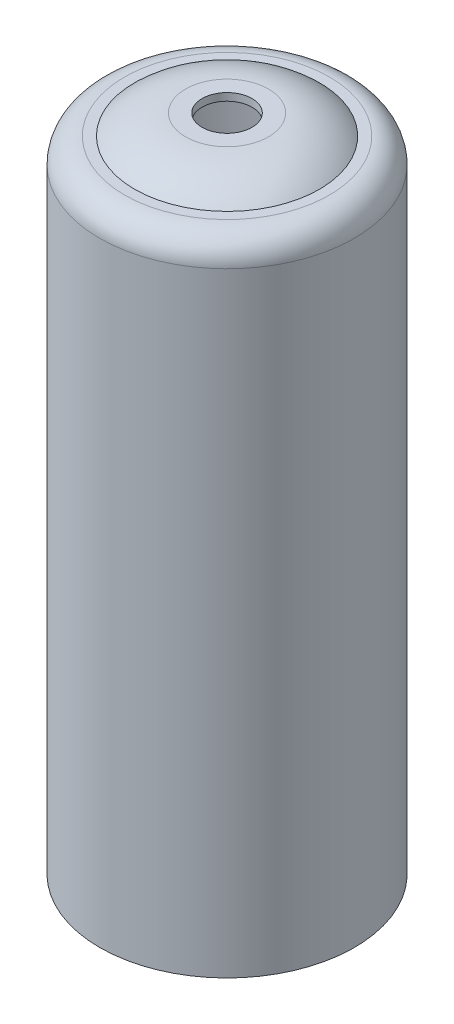
ISO-10303-21;
HEADER;
FILE_DESCRIPTION(('STEP AP214'),'2;1');
FILE_NAME('part.step','',(''),(''),'','','');
FILE_SCHEMA(('AUTOMOTIVE_DESIGN { 1 0 10303 214 1 1 1 1 }'));
ENDSEC;
DATA;
#1=APPLICATION_CONTEXT('core data for automotive mechanical design processes');
#2=APPLICATION_PROTOCOL_DEFINITION('international standard','automotive_design',2000,#1);
#3=PRODUCT_CONTEXT('',#1,'mechanical');
#4=PRODUCT('Part','Part','',(#3));
#5=PRODUCT_RELATED_PRODUCT_CATEGORY('part','',(#4));
#6=PRODUCT_DEFINITION_FORMATION('','',#4);
#7=PRODUCT_DEFINITION_CONTEXT('part definition',#1,'design');
#8=PRODUCT_DEFINITION('design','',#6,#7);
#9=PRODUCT_DEFINITION_SHAPE('','',#8);
#10=(LENGTH_UNIT() NAMED_UNIT(*) SI_UNIT(.MILLI.,.METRE.));
#11=(NAMED_UNIT(*) PLANE_ANGLE_UNIT() SI_UNIT($,.RADIAN.));
#12=(NAMED_UNIT(*) SI_UNIT($,.STERADIAN.) SOLID_ANGLE_UNIT());
#13=UNCERTAINTY_MEASURE_WITH_UNIT(LENGTH_MEASURE(1.E-05),#10,'distance_accuracy_value','');
#14=(GEOMETRIC_REPRESENTATION_CONTEXT(3) GLOBAL_UNCERTAINTY_ASSIGNED_CONTEXT((#13)) GLOBAL_UNIT_ASSIGNED_CONTEXT((#10,
#11,#12)) REPRESENTATION_CONTEXT('',''));
#15=CARTESIAN_POINT('',(0.,0.,0.));
#16=DIRECTION('',(0.,0.,1.));
#17=DIRECTION('',(1.,0.,0.));
#18=AXIS2_PLACEMENT_3D('',#15,#16,#17);
#19=CARTESIAN_POINT('',(0.,128.,0.));
#20=DIRECTION('',(0.,-1.,0.));
#21=DIRECTION('',(0.,0.,-1.));
#22=AXIS2_PLACEMENT_3D('',#19,#20,#21);
#23=CYLINDRICAL_SURFACE('',#22,25.5);
#24=CARTESIAN_POINT('',(0.,123.,0.));
#25=DIRECTION('',(0.,1.,0.));
#26=DIRECTION('',(0.,0.,1.));
#27=AXIS2_PLACEMENT_3D('',#24,#25,#26);
#28=CIRCLE('',#27,25.5);
#29=CARTESIAN_POINT('',(0.,123.,25.5));
#30=VERTEX_POINT('',#29);
#31=EDGE_CURVE('E45',#30,#30,#28,.F.);
#32=ORIENTED_EDGE('',*,*,#31,.T.);
#33=EDGE_LOOP('',(#32));
#34=FACE_BOUND('',#33,.T.);
#35=CARTESIAN_POINT('',(0.,0.,0.));
#36=DIRECTION('',(0.,1.,0.));
#37=DIRECTION('',(0.,0.,1.));
#38=AXIS2_PLACEMENT_3D('',#35,#36,#37);
#39=CIRCLE('',#38,25.5);
#40=CARTESIAN_POINT('',(0.,0.,25.5));
#41=VERTEX_POINT('',#40);
#42=EDGE_CURVE('E54',#41,#41,#39,.T.);
#43=ORIENTED_EDGE('',*,*,#42,.T.);
#44=EDGE_LOOP('',(#43));
#45=FACE_BOUND('',#44,.T.);
#46=ADVANCED_FACE('F37',(#34,#45),#23,.T.);
#47=CARTESIAN_POINT('',(0.,128.,0.));
#48=DIRECTION('',(0.,1.,0.));
#49=DIRECTION('',(0.,0.,1.));
#50=AXIS2_PLACEMENT_3D('',#47,#48,#49);
#51=PLANE('',#50);
#52=CARTESIAN_POINT('',(0.,128.,0.));
#53=DIRECTION('',(0.,1.,0.));
#54=DIRECTION('',(0.,0.,1.));
#55=AXIS2_PLACEMENT_3D('',#52,#53,#54);
#56=CIRCLE('',#55,18.5);
#57=CARTESIAN_POINT('',(0.,128.,18.5));
#58=VERTEX_POINT('',#57);
#59=EDGE_CURVE('E57',#58,#58,#56,.T.);
#60=ORIENTED_EDGE('',*,*,#59,.F.);
#61=EDGE_LOOP('',(#60));
#62=FACE_BOUND('',#61,.T.);
#63=CARTESIAN_POINT('',(0.,128.,0.));
#64=DIRECTION('',(0.,1.,0.));
#65=DIRECTION('',(0.,0.,1.));
#66=AXIS2_PLACEMENT_3D('',#63,#64,#65);
#67=CIRCLE('',#66,20.5);
#68=CARTESIAN_POINT('',(0.,128.,20.5));
#69=VERTEX_POINT('',#68);
#70=EDGE_CURVE('E49',#69,#69,#67,.T.);
#71=ORIENTED_EDGE('',*,*,#70,.T.);
#72=EDGE_LOOP('',(#71));
#73=FACE_BOUND('',#72,.T.);
#74=ADVANCED_FACE('F97',(#62,#73),#51,.T.);
#75=CARTESIAN_POINT('',(0.,0.,0.));
#76=DIRECTION('',(0.,1.,0.));
#77=DIRECTION('',(0.,0.,1.));
#78=AXIS2_PLACEMENT_3D('',#75,#76,#77);
#79=PLANE('',#78);
#80=CARTESIAN_POINT('',(0.,0.,0.));
#81=DIRECTION('',(0.,1.,0.));
#82=DIRECTION('',(0.,0.,1.));
#83=AXIS2_PLACEMENT_3D('',#80,#81,#82);
#84=CIRCLE('',#83,24.);
#85=CARTESIAN_POINT('',(0.,0.,24.));
#86=VERTEX_POINT('',#85);
#87=EDGE_CURVE('E61',#86,#86,#84,.T.);
#88=ORIENTED_EDGE('',*,*,#87,.T.);
#89=EDGE_LOOP('',(#88));
#90=FACE_BOUND('',#89,.T.);
#91=ORIENTED_EDGE('',*,*,#42,.F.);
#92=EDGE_LOOP('',(#91));
#93=FACE_BOUND('',#92,.T.);
#94=ADVANCED_FACE('F104',(#90,#93),#79,.F.);
#95=CARTESIAN_POINT('',(0.,123.,0.));
#96=DIRECTION('',(0.,1.,0.));
#97=DIRECTION('',(0.,0.,1.));
#98=AXIS2_PLACEMENT_3D('',#95,#96,#97);
#99=TOROIDAL_SURFACE('',#98,20.5,5.);
#100=ORIENTED_EDGE('',*,*,#31,.F.);
#101=EDGE_LOOP('',(#100));
#102=FACE_BOUND('',#101,.T.);
#103=ORIENTED_EDGE('',*,*,#70,.F.);
#104=EDGE_LOOP('',(#103));
#105=FACE_BOUND('',#104,.T.);
#106=ADVANCED_FACE('F109',(#102,#105),#99,.T.);
#107=CARTESIAN_POINT('',(0.,132.,0.));
#108=DIRECTION('',(0.,1.,0.));
#109=DIRECTION('',(0.,0.,1.));
#110=AXIS2_PLACEMENT_3D('',#107,#108,#109);
#111=PLANE('',#110);
#112=CARTESIAN_POINT('',(0.,132.,0.));
#113=DIRECTION('',(0.,1.,0.));
#114=DIRECTION('',(0.,0.,1.));
#115=AXIS2_PLACEMENT_3D('',#112,#113,#114);
#116=CIRCLE('',#115,5.);
#117=CARTESIAN_POINT('',(0.,132.,5.));
#118=VERTEX_POINT('',#117);
#119=EDGE_CURVE('E75',#118,#118,#116,.T.);
#120=ORIENTED_EDGE('',*,*,#119,.F.);
#121=EDGE_LOOP('',(#120));
#122=FACE_BOUND('',#121,.T.);
#123=CARTESIAN_POINT('',(0.,132.,0.));
#124=DIRECTION('',(0.,1.,0.));
#125=DIRECTION('',(0.,0.,1.));
#126=AXIS2_PLACEMENT_3D('',#123,#124,#125);
#127=CIRCLE('',#126,8.30196097281443);
#128=CARTESIAN_POINT('',(0.,132.,8.30196097281443));
#129=VERTEX_POINT('',#128);
#130=EDGE_CURVE('E10',#129,#129,#127,.T.);
#131=ORIENTED_EDGE('',*,*,#130,.T.);
#132=EDGE_LOOP('',(#131));
#133=FACE_BOUND('',#132,.T.);
#134=ADVANCED_FACE('F110',(#122,#133),#111,.T.);
#135=CARTESIAN_POINT('',(0.,117.,0.));
#136=DIRECTION('',(0.,-1.,0.));
#137=DIRECTION('',(0.,0.,-1.));
#138=AXIS2_PLACEMENT_3D('',#135,#136,#137);
#139=DEGENERATE_TOROIDAL_SURFACE('',#138,8.30196097281443,15.,.T.);
#140=ORIENTED_EDGE('',*,*,#59,.T.);
#141=EDGE_LOOP('',(#140));
#142=FACE_BOUND('',#141,.T.);
#143=ORIENTED_EDGE('',*,*,#130,.F.);
#144=EDGE_LOOP('',(#143));
#145=FACE_BOUND('',#144,.T.);
#146=ADVANCED_FACE('F39',(#142,#145),#139,.T.);
#147=CARTESIAN_POINT('',(0.,128.,0.));
#148=DIRECTION('',(0.,-1.,0.));
#149=DIRECTION('',(0.,0.,-1.));
#150=AXIS2_PLACEMENT_3D('',#147,#148,#149);
#151=CYLINDRICAL_SURFACE('',#150,24.);
#152=CARTESIAN_POINT('',(0.,123.,0.));
#153=DIRECTION('',(0.,-1.,0.));
#154=DIRECTION('',(0.,0.,-1.));
#155=AXIS2_PLACEMENT_3D('',#152,#153,#154);
#156=CIRCLE('',#155,24.);
#157=CARTESIAN_POINT('',(0.,123.,-24.));
#158=VERTEX_POINT('',#157);
#159=EDGE_CURVE('E68',#158,#158,#156,.T.);
#160=ORIENTED_EDGE('',*,*,#159,.F.);
#161=EDGE_LOOP('',(#160));
#162=FACE_BOUND('',#161,.T.);
#163=ORIENTED_EDGE('',*,*,#87,.F.);
#164=EDGE_LOOP('',(#163));
#165=FACE_BOUND('',#164,.T.);
#166=ADVANCED_FACE('F131',(#162,#165),#151,.F.);
#167=CARTESIAN_POINT('',(0.,126.5,0.));
#168=DIRECTION('',(0.,1.,0.));
#169=DIRECTION('',(0.,0.,1.));
#170=AXIS2_PLACEMENT_3D('',#167,#168,#169);
#171=PLANE('',#170);
#172=CARTESIAN_POINT('',(0.,126.5,0.));
#173=DIRECTION('',(0.,1.,0.));
#174=DIRECTION('',(0.,0.,1.));
#175=AXIS2_PLACEMENT_3D('',#172,#173,#174);
#176=CIRCLE('',#175,17.8936240194399);
#177=CARTESIAN_POINT('',(0.,126.5,17.8936240194399));
#178=VERTEX_POINT('',#177);
#179=EDGE_CURVE('E65',#178,#178,#176,.T.);
#180=ORIENTED_EDGE('',*,*,#179,.T.);
#181=EDGE_LOOP('',(#180));
#182=FACE_BOUND('',#181,.T.);
#183=CARTESIAN_POINT('',(0.,126.5,0.));
#184=DIRECTION('',(0.,1.,0.));
#185=DIRECTION('',(0.,0.,1.));
#186=AXIS2_PLACEMENT_3D('',#183,#184,#185);
#187=CIRCLE('',#186,20.5);
#188=CARTESIAN_POINT('',(0.,126.5,20.5));
#189=VERTEX_POINT('',#188);
#190=EDGE_CURVE('E64',#189,#189,#187,.T.);
#191=ORIENTED_EDGE('',*,*,#190,.F.);
#192=EDGE_LOOP('',(#191));
#193=FACE_BOUND('',#192,.T.);
#194=ADVANCED_FACE('F132',(#182,#193),#171,.F.);
#195=CARTESIAN_POINT('',(0.,123.,0.));
#196=DIRECTION('',(0.,1.,0.));
#197=DIRECTION('',(0.,0.,1.));
#198=AXIS2_PLACEMENT_3D('',#195,#196,#197);
#199=TOROIDAL_SURFACE('',#198,20.5,3.5);
#200=ORIENTED_EDGE('',*,*,#159,.T.);
#201=EDGE_LOOP('',(#200));
#202=FACE_BOUND('',#201,.T.);
#203=ORIENTED_EDGE('',*,*,#190,.T.);
#204=EDGE_LOOP('',(#203));
#205=FACE_BOUND('',#204,.T.);
#206=ADVANCED_FACE('F137',(#202,#205),#199,.F.);
#207=CARTESIAN_POINT('',(0.,130.5,0.));
#208=DIRECTION('',(0.,1.,0.));
#209=DIRECTION('',(0.,0.,1.));
#210=AXIS2_PLACEMENT_3D('',#207,#208,#209);
#211=PLANE('',#210);
#212=CARTESIAN_POINT('',(0.,130.5,0.));
#213=DIRECTION('',(0.,1.,0.));
#214=DIRECTION('',(0.,0.,1.));
#215=AXIS2_PLACEMENT_3D('',#212,#213,#214);
#216=CIRCLE('',#215,5.);
#217=CARTESIAN_POINT('',(0.,130.5,5.));
#218=VERTEX_POINT('',#217);
#219=EDGE_CURVE('E41',#218,#218,#216,.T.);
#220=ORIENTED_EDGE('',*,*,#219,.T.);
#221=EDGE_LOOP('',(#220));
#222=FACE_BOUND('',#221,.T.);
#223=CARTESIAN_POINT('',(0.,130.5,0.));
#224=DIRECTION('',(0.,-1.,0.));
#225=DIRECTION('',(0.,0.,-1.));
#226=AXIS2_PLACEMENT_3D('',#223,#224,#225);
#227=CIRCLE('',#226,8.30196097281443);
#228=CARTESIAN_POINT('',(0.,130.5,-8.30196097281443));
#229=VERTEX_POINT('',#228);
#230=EDGE_CURVE('E60',#229,#229,#227,.F.);
#231=ORIENTED_EDGE('',*,*,#230,.F.);
#232=EDGE_LOOP('',(#231));
#233=FACE_BOUND('',#232,.T.);
#234=ADVANCED_FACE('F82',(#222,#233),#211,.F.);
#235=CARTESIAN_POINT('',(0.,117.,0.));
#236=DIRECTION('',(0.,-1.,0.));
#237=DIRECTION('',(0.,0.,-1.));
#238=AXIS2_PLACEMENT_3D('',#235,#236,#237);
#239=DEGENERATE_TOROIDAL_SURFACE('',#238,8.30196097281443,13.5,.T.);
#240=ORIENTED_EDGE('',*,*,#179,.F.);
#241=EDGE_LOOP('',(#240));
#242=FACE_BOUND('',#241,.T.);
#243=ORIENTED_EDGE('',*,*,#230,.T.);
#244=EDGE_LOOP('',(#243));
#245=FACE_BOUND('',#244,.T.);
#246=ADVANCED_FACE('F87',(#242,#245),#239,.F.);
#247=CARTESIAN_POINT('',(0.,0.,0.));
#248=DIRECTION('',(0.,1.,0.));
#249=DIRECTION('',(0.,0.,1.));
#250=AXIS2_PLACEMENT_3D('',#247,#248,#249);
#251=CYLINDRICAL_SURFACE('',#250,5.);
#252=ORIENTED_EDGE('',*,*,#119,.T.);
#253=EDGE_LOOP('',(#252));
#254=FACE_BOUND('',#253,.T.);
#255=ORIENTED_EDGE('',*,*,#219,.F.);
#256=EDGE_LOOP('',(#255));
#257=FACE_BOUND('',#256,.T.);
#258=ADVANCED_FACE('F85',(#254,#257),#251,.F.);
#259=CLOSED_SHELL('',(#46,#74,#94,#106,#134,#146,#166,#194,#206,#234,#246,#258));
#260=MANIFOLD_SOLID_BREP('B2',#259);
#261=ADVANCED_BREP_SHAPE_REPRESENTATION('',(#18,#260),#14);
#262=SHAPE_DEFINITION_REPRESENTATION(#9,#261);
ENDSEC;
END-ISO-10303-21;
